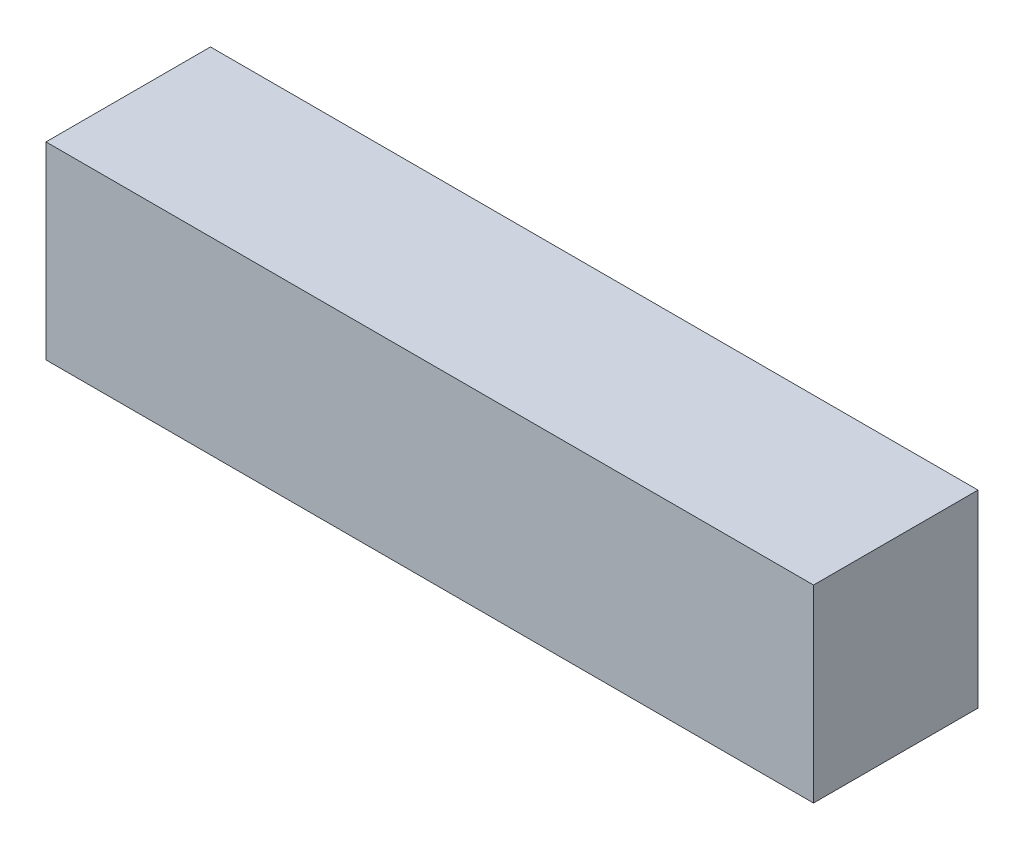
ISO-10303-21;
HEADER;
FILE_DESCRIPTION(('STEP AP214'),'2;1');
FILE_NAME('part.step','',(''),(''),'','','');
FILE_SCHEMA(('AUTOMOTIVE_DESIGN { 1 0 10303 214 1 1 1 1 }'));
ENDSEC;
DATA;
#1=APPLICATION_CONTEXT('core data for automotive mechanical design processes');
#2=APPLICATION_PROTOCOL_DEFINITION('international standard','automotive_design',2000,#1);
#3=PRODUCT_CONTEXT('',#1,'mechanical');
#4=PRODUCT('Part','Part','',(#3));
#5=PRODUCT_RELATED_PRODUCT_CATEGORY('part','',(#4));
#6=PRODUCT_DEFINITION_FORMATION('','',#4);
#7=PRODUCT_DEFINITION_CONTEXT('part definition',#1,'design');
#8=PRODUCT_DEFINITION('design','',#6,#7);
#9=PRODUCT_DEFINITION_SHAPE('','',#8);
#10=(LENGTH_UNIT() NAMED_UNIT(*) SI_UNIT(.MILLI.,.METRE.));
#11=(NAMED_UNIT(*) PLANE_ANGLE_UNIT() SI_UNIT($,.RADIAN.));
#12=(NAMED_UNIT(*) SI_UNIT($,.STERADIAN.) SOLID_ANGLE_UNIT());
#13=UNCERTAINTY_MEASURE_WITH_UNIT(LENGTH_MEASURE(1.E-05),#10,'distance_accuracy_value','');
#14=(GEOMETRIC_REPRESENTATION_CONTEXT(3) GLOBAL_UNCERTAINTY_ASSIGNED_CONTEXT((#13)) GLOBAL_UNIT_ASSIGNED_CONTEXT((#10,
#11,#12)) REPRESENTATION_CONTEXT('',''));
#15=CARTESIAN_POINT('',(0.,0.,0.));
#16=DIRECTION('',(0.,0.,1.));
#17=DIRECTION('',(1.,0.,0.));
#18=AXIS2_PLACEMENT_3D('',#15,#16,#17);
#19=CARTESIAN_POINT('',(-2.88,0.,40.5));
#20=DIRECTION('',(0.,0.,1.));
#21=DIRECTION('',(1.,0.,0.));
#22=AXIS2_PLACEMENT_3D('',#19,#20,#21);
#23=PLANE('',#22);
#24=DIRECTION('',(1.,0.,0.));
#25=VECTOR('',#24,1.);
#26=CARTESIAN_POINT('',(-34.38,-7.75,40.5));
#27=LINE('',#26,#25);
#28=CARTESIAN_POINT('',(-34.38,-7.75,40.5));
#29=VERTEX_POINT('',#28);
#30=CARTESIAN_POINT('',(28.62,-7.75,40.5));
#31=VERTEX_POINT('',#30);
#32=EDGE_CURVE('E79',#29,#31,#27,.T.);
#33=ORIENTED_EDGE('',*,*,#32,.T.);
#34=DIRECTION('',(0.,1.,0.));
#35=VECTOR('',#34,1.);
#36=CARTESIAN_POINT('',(28.62,-7.75,40.5));
#37=LINE('',#36,#35);
#38=CARTESIAN_POINT('',(28.62,7.75,40.5));
#39=VERTEX_POINT('',#38);
#40=EDGE_CURVE('E94',#31,#39,#37,.T.);
#41=ORIENTED_EDGE('',*,*,#40,.T.);
#42=DIRECTION('',(-1.,0.,0.));
#43=VECTOR('',#42,1.);
#44=CARTESIAN_POINT('',(28.62,7.75,40.5));
#45=LINE('',#44,#43);
#46=CARTESIAN_POINT('',(-34.38,7.75,40.5));
#47=VERTEX_POINT('',#46);
#48=EDGE_CURVE('E73',#39,#47,#45,.T.);
#49=ORIENTED_EDGE('',*,*,#48,.T.);
#50=DIRECTION('',(0.,-1.,0.));
#51=VECTOR('',#50,1.);
#52=CARTESIAN_POINT('',(-34.38,7.75,40.5));
#53=LINE('',#52,#51);
#54=EDGE_CURVE('E9',#47,#29,#53,.T.);
#55=ORIENTED_EDGE('',*,*,#54,.T.);
#56=EDGE_LOOP('',(#33,#41,#49,#55));
#57=FACE_BOUND('',#56,.T.);
#58=ADVANCED_FACE('F15',(#57),#23,.T.);
#59=CARTESIAN_POINT('',(-2.88,0.,27.));
#60=DIRECTION('',(0.,0.,1.));
#61=DIRECTION('',(1.,0.,0.));
#62=AXIS2_PLACEMENT_3D('',#59,#60,#61);
#63=PLANE('',#62);
#64=DIRECTION('',(0.,-1.,0.));
#65=VECTOR('',#64,1.);
#66=CARTESIAN_POINT('',(-34.38,7.75,27.));
#67=LINE('',#66,#65);
#68=CARTESIAN_POINT('',(-34.38,7.75,27.));
#69=VERTEX_POINT('',#68);
#70=CARTESIAN_POINT('',(-34.38,-7.75,27.));
#71=VERTEX_POINT('',#70);
#72=EDGE_CURVE('E18',#69,#71,#67,.T.);
#73=ORIENTED_EDGE('',*,*,#72,.F.);
#74=DIRECTION('',(-1.,0.,0.));
#75=VECTOR('',#74,1.);
#76=CARTESIAN_POINT('',(28.62,7.75,27.));
#77=LINE('',#76,#75);
#78=CARTESIAN_POINT('',(28.62,7.75,27.));
#79=VERTEX_POINT('',#78);
#80=EDGE_CURVE('E98',#79,#69,#77,.T.);
#81=ORIENTED_EDGE('',*,*,#80,.F.);
#82=DIRECTION('',(0.,1.,0.));
#83=VECTOR('',#82,1.);
#84=CARTESIAN_POINT('',(28.62,-7.75,27.));
#85=LINE('',#84,#83);
#86=CARTESIAN_POINT('',(28.62,-7.75,27.));
#87=VERTEX_POINT('',#86);
#88=EDGE_CURVE('E85',#87,#79,#85,.T.);
#89=ORIENTED_EDGE('',*,*,#88,.F.);
#90=DIRECTION('',(1.,0.,0.));
#91=VECTOR('',#90,1.);
#92=CARTESIAN_POINT('',(-34.38,-7.75,27.));
#93=LINE('',#92,#91);
#94=EDGE_CURVE('E77',#71,#87,#93,.T.);
#95=ORIENTED_EDGE('',*,*,#94,.F.);
#96=EDGE_LOOP('',(#73,#81,#89,#95));
#97=FACE_BOUND('',#96,.T.);
#98=ADVANCED_FACE('F82',(#97),#63,.F.);
#99=CARTESIAN_POINT('',(-34.38,7.75,27.));
#100=DIRECTION('',(1.,0.,0.));
#101=DIRECTION('',(0.,1.,0.));
#102=AXIS2_PLACEMENT_3D('',#99,#100,#101);
#103=PLANE('',#102);
#104=ORIENTED_EDGE('',*,*,#72,.T.);
#105=DIRECTION('',(0.,0.,1.));
#106=VECTOR('',#105,1.);
#107=CARTESIAN_POINT('',(-34.38,-7.75,27.));
#108=LINE('',#107,#106);
#109=EDGE_CURVE('E70',#71,#29,#108,.T.);
#110=ORIENTED_EDGE('',*,*,#109,.T.);
#111=ORIENTED_EDGE('',*,*,#54,.F.);
#112=DIRECTION('',(0.,0.,1.));
#113=VECTOR('',#112,1.);
#114=CARTESIAN_POINT('',(-34.38,7.75,27.));
#115=LINE('',#114,#113);
#116=EDGE_CURVE('E69',#69,#47,#115,.T.);
#117=ORIENTED_EDGE('',*,*,#116,.F.);
#118=EDGE_LOOP('',(#104,#110,#111,#117));
#119=FACE_BOUND('',#118,.T.);
#120=ADVANCED_FACE('F66',(#119),#103,.F.);
#121=CARTESIAN_POINT('',(28.62,7.75,27.));
#122=DIRECTION('',(0.,-1.,0.));
#123=DIRECTION('',(0.,0.,-1.));
#124=AXIS2_PLACEMENT_3D('',#121,#122,#123);
#125=PLANE('',#124);
#126=ORIENTED_EDGE('',*,*,#80,.T.);
#127=ORIENTED_EDGE('',*,*,#116,.T.);
#128=ORIENTED_EDGE('',*,*,#48,.F.);
#129=DIRECTION('',(0.,0.,1.));
#130=VECTOR('',#129,1.);
#131=CARTESIAN_POINT('',(28.62,7.75,27.));
#132=LINE('',#131,#130);
#133=EDGE_CURVE('E97',#79,#39,#132,.T.);
#134=ORIENTED_EDGE('',*,*,#133,.F.);
#135=EDGE_LOOP('',(#126,#127,#128,#134));
#136=FACE_BOUND('',#135,.T.);
#137=ADVANCED_FACE('F113',(#136),#125,.F.);
#138=CARTESIAN_POINT('',(28.62,-7.75,27.));
#139=DIRECTION('',(-1.,0.,0.));
#140=DIRECTION('',(0.,0.,1.));
#141=AXIS2_PLACEMENT_3D('',#138,#139,#140);
#142=PLANE('',#141);
#143=ORIENTED_EDGE('',*,*,#88,.T.);
#144=ORIENTED_EDGE('',*,*,#133,.T.);
#145=ORIENTED_EDGE('',*,*,#40,.F.);
#146=DIRECTION('',(0.,0.,1.));
#147=VECTOR('',#146,1.);
#148=CARTESIAN_POINT('',(28.62,-7.75,27.));
#149=LINE('',#148,#147);
#150=EDGE_CURVE('E86',#87,#31,#149,.T.);
#151=ORIENTED_EDGE('',*,*,#150,.F.);
#152=EDGE_LOOP('',(#143,#144,#145,#151));
#153=FACE_BOUND('',#152,.T.);
#154=ADVANCED_FACE('F117',(#153),#142,.F.);
#155=CARTESIAN_POINT('',(-34.38,-7.75,27.));
#156=DIRECTION('',(0.,1.,0.));
#157=DIRECTION('',(1.,0.,0.));
#158=AXIS2_PLACEMENT_3D('',#155,#156,#157);
#159=PLANE('',#158);
#160=ORIENTED_EDGE('',*,*,#94,.T.);
#161=ORIENTED_EDGE('',*,*,#150,.T.);
#162=ORIENTED_EDGE('',*,*,#32,.F.);
#163=ORIENTED_EDGE('',*,*,#109,.F.);
#164=EDGE_LOOP('',(#160,#161,#162,#163));
#165=FACE_BOUND('',#164,.T.);
#166=ADVANCED_FACE('F76',(#165),#159,.F.);
#167=CLOSED_SHELL('',(#58,#98,#120,#137,#154,#166));
#168=MANIFOLD_SOLID_BREP('B1',#167);
#169=ADVANCED_BREP_SHAPE_REPRESENTATION('',(#18,#168),#14);
#170=SHAPE_DEFINITION_REPRESENTATION(#9,#169);
ENDSEC;
END-ISO-10303-21;
